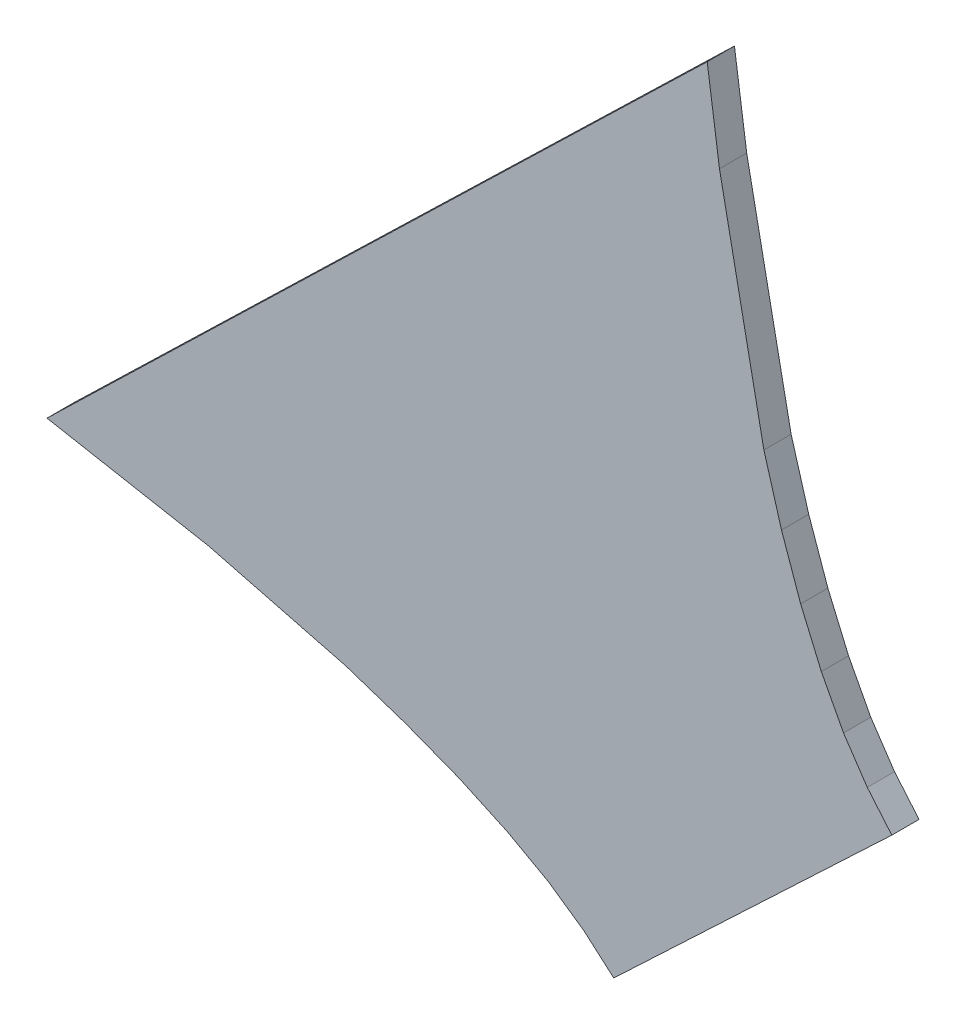
ISO-10303-21;
HEADER;
FILE_DESCRIPTION(('STEP AP214'),'2;1');
FILE_NAME('part.step','',(''),(''),'','','');
FILE_SCHEMA(('AUTOMOTIVE_DESIGN { 1 0 10303 214 1 1 1 1 }'));
ENDSEC;
DATA;
#1=APPLICATION_CONTEXT('core data for automotive mechanical design processes');
#2=APPLICATION_PROTOCOL_DEFINITION('international standard','automotive_design',2000,#1);
#3=PRODUCT_CONTEXT('',#1,'mechanical');
#4=PRODUCT('Part','Part','',(#3));
#5=PRODUCT_RELATED_PRODUCT_CATEGORY('part','',(#4));
#6=PRODUCT_DEFINITION_FORMATION('','',#4);
#7=PRODUCT_DEFINITION_CONTEXT('part definition',#1,'design');
#8=PRODUCT_DEFINITION('design','',#6,#7);
#9=PRODUCT_DEFINITION_SHAPE('','',#8);
#10=(LENGTH_UNIT() NAMED_UNIT(*) SI_UNIT(.MILLI.,.METRE.));
#11=(NAMED_UNIT(*) PLANE_ANGLE_UNIT() SI_UNIT($,.RADIAN.));
#12=(NAMED_UNIT(*) SI_UNIT($,.STERADIAN.) SOLID_ANGLE_UNIT());
#13=UNCERTAINTY_MEASURE_WITH_UNIT(LENGTH_MEASURE(1.E-05),#10,'distance_accuracy_value','');
#14=(GEOMETRIC_REPRESENTATION_CONTEXT(3) GLOBAL_UNCERTAINTY_ASSIGNED_CONTEXT((#13)) GLOBAL_UNIT_ASSIGNED_CONTEXT((#10,
#11,#12)) REPRESENTATION_CONTEXT('',''));
#15=CARTESIAN_POINT('',(0.,0.,0.));
#16=DIRECTION('',(0.,0.,1.));
#17=DIRECTION('',(1.,0.,0.));
#18=AXIS2_PLACEMENT_3D('',#15,#16,#17);
#19=CARTESIAN_POINT('',(49.0960006713867,108.747001647949,0.));
#20=DIRECTION('',(-0.764913189247132,-0.644133381308391,0.));
#21=DIRECTION('',(-0.644133381308391,0.764913189247132,0.));
#22=AXIS2_PLACEMENT_3D('',#19,#20,#21);
#23=PLANE('',#22);
#24=DIRECTION('',(-0.644133381308391,0.764913189247132,0.));
#25=VECTOR('',#24,1.);
#26=CARTESIAN_POINT('',(49.0960006713867,108.747001647949,0.03556));
#27=LINE('',#26,#25);
#28=CARTESIAN_POINT('',(49.0960006713867,108.747001647949,0.03556));
#29=VERTEX_POINT('',#28);
#30=CARTESIAN_POINT('',(49.0639991760254,108.785003662109,0.03556));
#31=VERTEX_POINT('',#30);
#32=EDGE_CURVE('E11',#29,#31,#27,.T.);
#33=ORIENTED_EDGE('',*,*,#32,.F.);
#34=DIRECTION('',(0.,0.,1.));
#35=VECTOR('',#34,1.);
#36=CARTESIAN_POINT('',(49.0960006713867,108.747001647949,0.));
#37=LINE('',#36,#35);
#38=CARTESIAN_POINT('',(49.0960006713867,108.747001647949,0.));
#39=VERTEX_POINT('',#38);
#40=EDGE_CURVE('E24',#39,#29,#37,.T.);
#41=ORIENTED_EDGE('',*,*,#40,.F.);
#42=DIRECTION('',(-0.644133381308391,0.764913189247132,0.));
#43=VECTOR('',#42,1.);
#44=CARTESIAN_POINT('',(49.0960006713867,108.747001647949,0.));
#45=LINE('',#44,#43);
#46=CARTESIAN_POINT('',(49.0639991760254,108.785003662109,0.));
#47=VERTEX_POINT('',#46);
#48=EDGE_CURVE('E160',#39,#47,#45,.T.);
#49=ORIENTED_EDGE('',*,*,#48,.T.);
#50=DIRECTION('',(0.,0.,1.));
#51=VECTOR('',#50,1.);
#52=CARTESIAN_POINT('',(49.0639991760254,108.785003662109,0.));
#53=LINE('',#52,#51);
#54=EDGE_CURVE('E37',#47,#31,#53,.T.);
#55=ORIENTED_EDGE('',*,*,#54,.T.);
#56=EDGE_LOOP('',(#33,#41,#49,#55));
#57=FACE_BOUND('',#56,.T.);
#58=ADVANCED_FACE('F17',(#57),#23,.F.);
#59=CARTESIAN_POINT('',(49.0639991760254,108.785003662109,0.));
#60=DIRECTION('',(-0.829267813334894,-0.558851405801903,0.));
#61=DIRECTION('',(-0.558851405801903,0.829267813334894,0.));
#62=AXIS2_PLACEMENT_3D('',#59,#60,#61);
#63=PLANE('',#62);
#64=DIRECTION('',(-0.558851405801903,0.829267813334894,0.));
#65=VECTOR('',#64,1.);
#66=CARTESIAN_POINT('',(49.0639991760254,108.785003662109,0.03556));
#67=LINE('',#66,#65);
#68=CARTESIAN_POINT('',(49.0330009460449,108.831001281738,0.03556));
#69=VERTEX_POINT('',#68);
#70=EDGE_CURVE('E280',#31,#69,#67,.T.);
#71=ORIENTED_EDGE('',*,*,#70,.F.);
#72=ORIENTED_EDGE('',*,*,#54,.F.);
#73=DIRECTION('',(-0.558851405801903,0.829267813334894,0.));
#74=VECTOR('',#73,1.);
#75=CARTESIAN_POINT('',(49.0639991760254,108.785003662109,0.));
#76=LINE('',#75,#74);
#77=CARTESIAN_POINT('',(49.0330009460449,108.831001281738,0.));
#78=VERTEX_POINT('',#77);
#79=EDGE_CURVE('E277',#47,#78,#76,.T.);
#80=ORIENTED_EDGE('',*,*,#79,.T.);
#81=DIRECTION('',(0.,0.,1.));
#82=VECTOR('',#81,1.);
#83=CARTESIAN_POINT('',(49.0330009460449,108.831001281738,0.));
#84=LINE('',#83,#82);
#85=EDGE_CURVE('E275',#78,#69,#84,.T.);
#86=ORIENTED_EDGE('',*,*,#85,.T.);
#87=EDGE_LOOP('',(#71,#72,#80,#86));
#88=FACE_BOUND('',#87,.T.);
#89=ADVANCED_FACE('F288',(#88),#63,.F.);
#90=CARTESIAN_POINT('',(49.0330009460449,108.831001281738,0.));
#91=DIRECTION('',(-0.884574623064749,-0.466398688066183,0.));
#92=DIRECTION('',(-0.466398688066183,0.884574623064749,0.));
#93=AXIS2_PLACEMENT_3D('',#90,#91,#92);
#94=PLANE('',#93);
#95=DIRECTION('',(-0.466398688066183,0.884574623064749,0.));
#96=VECTOR('',#95,1.);
#97=CARTESIAN_POINT('',(49.0330009460449,108.831001281738,0.03556));
#98=LINE('',#97,#96);
#99=CARTESIAN_POINT('',(49.0040016174316,108.886001586914,0.03556));
#100=VERTEX_POINT('',#99);
#101=EDGE_CURVE('E272',#69,#100,#98,.T.);
#102=ORIENTED_EDGE('',*,*,#101,.F.);
#103=ORIENTED_EDGE('',*,*,#85,.F.);
#104=DIRECTION('',(-0.466398688066183,0.884574623064749,0.));
#105=VECTOR('',#104,1.);
#106=CARTESIAN_POINT('',(49.0330009460449,108.831001281738,0.));
#107=LINE('',#106,#105);
#108=CARTESIAN_POINT('',(49.0040016174316,108.886001586914,0.));
#109=VERTEX_POINT('',#108);
#110=EDGE_CURVE('E269',#78,#109,#107,.T.);
#111=ORIENTED_EDGE('',*,*,#110,.T.);
#112=DIRECTION('',(0.,0.,1.));
#113=VECTOR('',#112,1.);
#114=CARTESIAN_POINT('',(49.0040016174316,108.886001586914,0.));
#115=LINE('',#114,#113);
#116=EDGE_CURVE('E267',#109,#100,#115,.T.);
#117=ORIENTED_EDGE('',*,*,#116,.T.);
#118=EDGE_LOOP('',(#102,#103,#111,#117));
#119=FACE_BOUND('',#118,.T.);
#120=ADVANCED_FACE('F294',(#119),#94,.F.);
#121=CARTESIAN_POINT('',(49.0040016174316,108.886001586914,0.));
#122=DIRECTION('',(-0.919133514210847,-0.393946167711298,0.));
#123=DIRECTION('',(-0.393946167711298,0.919133514210847,0.));
#124=AXIS2_PLACEMENT_3D('',#121,#122,#123);
#125=PLANE('',#124);
#126=DIRECTION('',(-0.393946167711298,0.919133514210847,0.));
#127=VECTOR('',#126,1.);
#128=CARTESIAN_POINT('',(49.0040016174316,108.886001586914,0.03556));
#129=LINE('',#128,#127);
#130=CARTESIAN_POINT('',(48.9770011901855,108.948997497559,0.03556));
#131=VERTEX_POINT('',#130);
#132=EDGE_CURVE('E264',#100,#131,#129,.T.);
#133=ORIENTED_EDGE('',*,*,#132,.F.);
#134=ORIENTED_EDGE('',*,*,#116,.F.);
#135=DIRECTION('',(-0.393946167711298,0.919133514210847,0.));
#136=VECTOR('',#135,1.);
#137=CARTESIAN_POINT('',(49.0040016174316,108.886001586914,0.));
#138=LINE('',#137,#136);
#139=CARTESIAN_POINT('',(48.9770011901855,108.948997497559,0.));
#140=VERTEX_POINT('',#139);
#141=EDGE_CURVE('E261',#109,#140,#138,.T.);
#142=ORIENTED_EDGE('',*,*,#141,.T.);
#143=DIRECTION('',(0.,0.,1.));
#144=VECTOR('',#143,1.);
#145=CARTESIAN_POINT('',(48.9770011901855,108.948997497559,0.));
#146=LINE('',#145,#144);
#147=EDGE_CURVE('E259',#140,#131,#146,.T.);
#148=ORIENTED_EDGE('',*,*,#147,.T.);
#149=EDGE_LOOP('',(#133,#134,#142,#148));
#150=FACE_BOUND('',#149,.T.);
#151=ADVANCED_FACE('F296',(#150),#125,.F.);
#152=CARTESIAN_POINT('',(48.9770011901855,108.948997497559,0.));
#153=DIRECTION('',(-0.943227736251427,-0.332146710906504,0.));
#154=DIRECTION('',(-0.332146710906504,0.943227736251427,0.));
#155=AXIS2_PLACEMENT_3D('',#152,#153,#154);
#156=PLANE('',#155);
#157=DIRECTION('',(-0.332146710906504,0.943227736251427,0.));
#158=VECTOR('',#157,1.);
#159=CARTESIAN_POINT('',(48.9770011901855,108.948997497559,0.03556));
#160=LINE('',#159,#158);
#161=CARTESIAN_POINT('',(48.9519996643066,109.019996643066,0.03556));
#162=VERTEX_POINT('',#161);
#163=EDGE_CURVE('E256',#131,#162,#160,.T.);
#164=ORIENTED_EDGE('',*,*,#163,.F.);
#165=ORIENTED_EDGE('',*,*,#147,.F.);
#166=DIRECTION('',(-0.332146710906504,0.943227736251427,0.));
#167=VECTOR('',#166,1.);
#168=CARTESIAN_POINT('',(48.9770011901855,108.948997497559,0.));
#169=LINE('',#168,#167);
#170=CARTESIAN_POINT('',(48.9519996643066,109.019996643066,0.));
#171=VERTEX_POINT('',#170);
#172=EDGE_CURVE('E253',#140,#171,#169,.T.);
#173=ORIENTED_EDGE('',*,*,#172,.T.);
#174=DIRECTION('',(0.,0.,1.));
#175=VECTOR('',#174,1.);
#176=CARTESIAN_POINT('',(48.9519996643066,109.019996643066,0.));
#177=LINE('',#176,#175);
#178=EDGE_CURVE('E251',#171,#162,#177,.T.);
#179=ORIENTED_EDGE('',*,*,#178,.T.);
#180=EDGE_LOOP('',(#164,#165,#173,#179));
#181=FACE_BOUND('',#180,.T.);
#182=ADVANCED_FACE('F301',(#181),#156,.F.);
#183=CARTESIAN_POINT('',(48.9519996643066,109.019996643066,0.));
#184=DIRECTION('',(-0.96014214957302,-0.279512168989654,0.));
#185=DIRECTION('',(-0.279512168989654,0.96014214957302,0.));
#186=AXIS2_PLACEMENT_3D('',#183,#184,#185);
#187=PLANE('',#186);
#188=DIRECTION('',(-0.279512168989654,0.96014214957302,0.));
#189=VECTOR('',#188,1.);
#190=CARTESIAN_POINT('',(48.9519996643066,109.019996643066,0.03556));
#191=LINE('',#190,#189);
#192=CARTESIAN_POINT('',(48.9290008544922,109.098999023438,0.03556));
#193=VERTEX_POINT('',#192);
#194=EDGE_CURVE('E248',#162,#193,#191,.T.);
#195=ORIENTED_EDGE('',*,*,#194,.F.);
#196=ORIENTED_EDGE('',*,*,#178,.F.);
#197=DIRECTION('',(-0.279512168989654,0.96014214957302,0.));
#198=VECTOR('',#197,1.);
#199=CARTESIAN_POINT('',(48.9519996643066,109.019996643066,0.));
#200=LINE('',#199,#198);
#201=CARTESIAN_POINT('',(48.9290008544922,109.098999023438,0.));
#202=VERTEX_POINT('',#201);
#203=EDGE_CURVE('E245',#171,#202,#200,.T.);
#204=ORIENTED_EDGE('',*,*,#203,.T.);
#205=DIRECTION('',(0.,0.,1.));
#206=VECTOR('',#205,1.);
#207=CARTESIAN_POINT('',(48.9290008544922,109.098999023438,0.));
#208=LINE('',#207,#206);
#209=EDGE_CURVE('E243',#202,#193,#208,.T.);
#210=ORIENTED_EDGE('',*,*,#209,.T.);
#211=EDGE_LOOP('',(#195,#196,#204,#210));
#212=FACE_BOUND('',#211,.T.);
#213=ADVANCED_FACE('F304',(#212),#187,.F.);
#214=CARTESIAN_POINT('',(48.9290008544922,109.098999023438,0.));
#215=DIRECTION('',(-0.980448550082548,-0.196775609873352,0.));
#216=DIRECTION('',(-0.196775609873352,0.980448550082548,0.));
#217=AXIS2_PLACEMENT_3D('',#214,#215,#216);
#218=PLANE('',#217);
#219=DIRECTION('',(-0.196775609873352,0.980448550082548,0.));
#220=VECTOR('',#219,1.);
#221=CARTESIAN_POINT('',(48.9290008544922,109.098999023438,0.03556));
#222=LINE('',#221,#220);
#223=CARTESIAN_POINT('',(48.8709983825684,109.388000488281,0.03556));
#224=VERTEX_POINT('',#223);
#225=EDGE_CURVE('E240',#193,#224,#222,.T.);
#226=ORIENTED_EDGE('',*,*,#225,.F.);
#227=ORIENTED_EDGE('',*,*,#209,.F.);
#228=DIRECTION('',(-0.196775609873352,0.980448550082548,0.));
#229=VECTOR('',#228,1.);
#230=CARTESIAN_POINT('',(48.9290008544922,109.098999023438,0.));
#231=LINE('',#230,#229);
#232=CARTESIAN_POINT('',(48.8709983825684,109.388000488281,0.));
#233=VERTEX_POINT('',#232);
#234=EDGE_CURVE('E237',#202,#233,#231,.T.);
#235=ORIENTED_EDGE('',*,*,#234,.T.);
#236=DIRECTION('',(0.,0.,1.));
#237=VECTOR('',#236,1.);
#238=CARTESIAN_POINT('',(48.8709983825684,109.388000488281,0.));
#239=LINE('',#238,#237);
#240=EDGE_CURVE('E235',#233,#224,#239,.T.);
#241=ORIENTED_EDGE('',*,*,#240,.T.);
#242=EDGE_LOOP('',(#226,#227,#235,#241));
#243=FACE_BOUND('',#242,.T.);
#244=ADVANCED_FACE('F309',(#243),#218,.F.);
#245=CARTESIAN_POINT('',(48.8709983825684,109.388000488281,0.));
#246=DIRECTION('',(-0.990125208563686,-0.140185845814466,0.));
#247=DIRECTION('',(-0.140185845814466,0.990125208563686,0.));
#248=AXIS2_PLACEMENT_3D('',#245,#246,#247);
#249=PLANE('',#248);
#250=DIRECTION('',(-0.140185845814466,0.990125208563686,0.));
#251=VECTOR('',#250,1.);
#252=CARTESIAN_POINT('',(48.8709983825684,109.388000488281,0.03556));
#253=LINE('',#252,#251);
#254=CARTESIAN_POINT('',(48.8549995422363,109.500999450684,0.03556));
#255=VERTEX_POINT('',#254);
#256=EDGE_CURVE('E232',#224,#255,#253,.T.);
#257=ORIENTED_EDGE('',*,*,#256,.F.);
#258=ORIENTED_EDGE('',*,*,#240,.F.);
#259=DIRECTION('',(-0.140185845814466,0.990125208563686,0.));
#260=VECTOR('',#259,1.);
#261=CARTESIAN_POINT('',(48.8709983825684,109.388000488281,0.));
#262=LINE('',#261,#260);
#263=CARTESIAN_POINT('',(48.8549995422363,109.500999450684,0.));
#264=VERTEX_POINT('',#263);
#265=EDGE_CURVE('E229',#233,#264,#262,.T.);
#266=ORIENTED_EDGE('',*,*,#265,.T.);
#267=DIRECTION('',(0.,0.,1.));
#268=VECTOR('',#267,1.);
#269=CARTESIAN_POINT('',(48.8549995422363,109.500999450684,0.));
#270=LINE('',#269,#268);
#271=EDGE_CURVE('E227',#264,#255,#270,.T.);
#272=ORIENTED_EDGE('',*,*,#271,.T.);
#273=EDGE_LOOP('',(#257,#258,#266,#272));
#274=FACE_BOUND('',#273,.T.);
#275=ADVANCED_FACE('F312',(#274),#249,.F.);
#276=CARTESIAN_POINT('',(48.8549995422363,109.500999450684,0.));
#277=DIRECTION('',(0.69533813950602,-0.718682733720733,0.));
#278=DIRECTION('',(-0.718682733720733,-0.69533813950602,0.));
#279=AXIS2_PLACEMENT_3D('',#276,#277,#278);
#280=PLANE('',#279);
#281=DIRECTION('',(-0.718682733720733,-0.69533813950602,0.));
#282=VECTOR('',#281,1.);
#283=CARTESIAN_POINT('',(48.8549995422363,109.500999450684,0.03556));
#284=LINE('',#283,#282);
#285=CARTESIAN_POINT('',(47.9930000305176,108.666999816895,0.03556));
#286=VERTEX_POINT('',#285);
#287=EDGE_CURVE('E224',#255,#286,#284,.T.);
#288=ORIENTED_EDGE('',*,*,#287,.F.);
#289=ORIENTED_EDGE('',*,*,#271,.F.);
#290=DIRECTION('',(-0.718682733720733,-0.69533813950602,0.));
#291=VECTOR('',#290,1.);
#292=CARTESIAN_POINT('',(48.8549995422363,109.500999450684,0.));
#293=LINE('',#292,#291);
#294=CARTESIAN_POINT('',(47.9930000305176,108.666999816895,0.));
#295=VERTEX_POINT('',#294);
#296=EDGE_CURVE('E221',#264,#295,#293,.T.);
#297=ORIENTED_EDGE('',*,*,#296,.T.);
#298=DIRECTION('',(0.,0.,1.));
#299=VECTOR('',#298,1.);
#300=CARTESIAN_POINT('',(47.9930000305176,108.666999816895,0.));
#301=LINE('',#300,#299);
#302=EDGE_CURVE('E219',#295,#286,#301,.T.);
#303=ORIENTED_EDGE('',*,*,#302,.T.);
#304=EDGE_LOOP('',(#288,#289,#297,#303));
#305=FACE_BOUND('',#304,.T.);
#306=ADVANCED_FACE('F317',(#305),#280,.F.);
#307=CARTESIAN_POINT('',(47.9930000305176,108.666999816895,0.));
#308=DIRECTION('',(0.181763302610869,0.983342311620928,0.));
#309=DIRECTION('',(0.983342311620928,-0.181763302610869,0.));
#310=AXIS2_PLACEMENT_3D('',#307,#308,#309);
#311=PLANE('',#310);
#312=DIRECTION('',(0.983342311620928,-0.181763302610869,0.));
#313=VECTOR('',#312,1.);
#314=CARTESIAN_POINT('',(47.9930000305176,108.666999816895,0.03556));
#315=LINE('',#314,#313);
#316=CARTESIAN_POINT('',(48.2039985656738,108.627998352051,0.03556));
#317=VERTEX_POINT('',#316);
#318=EDGE_CURVE('E216',#286,#317,#315,.T.);
#319=ORIENTED_EDGE('',*,*,#318,.F.);
#320=ORIENTED_EDGE('',*,*,#302,.F.);
#321=DIRECTION('',(0.983342311620928,-0.181763302610869,0.));
#322=VECTOR('',#321,1.);
#323=CARTESIAN_POINT('',(47.9930000305176,108.666999816895,0.));
#324=LINE('',#323,#322);
#325=CARTESIAN_POINT('',(48.2039985656738,108.627998352051,0.));
#326=VERTEX_POINT('',#325);
#327=EDGE_CURVE('E213',#295,#326,#324,.T.);
#328=ORIENTED_EDGE('',*,*,#327,.T.);
#329=DIRECTION('',(0.,0.,1.));
#330=VECTOR('',#329,1.);
#331=CARTESIAN_POINT('',(48.2039985656738,108.627998352051,0.));
#332=LINE('',#331,#330);
#333=EDGE_CURVE('E211',#326,#317,#332,.T.);
#334=ORIENTED_EDGE('',*,*,#333,.T.);
#335=EDGE_LOOP('',(#319,#320,#328,#334));
#336=FACE_BOUND('',#335,.T.);
#337=ADVANCED_FACE('F320',(#336),#311,.F.);
#338=CARTESIAN_POINT('',(48.2039985656738,108.627998352051,0.));
#339=DIRECTION('',(0.248882834999319,0.968533600058719,0.));
#340=DIRECTION('',(0.968533600058719,-0.248882834999319,0.));
#341=AXIS2_PLACEMENT_3D('',#338,#339,#340);
#342=PLANE('',#341);
#343=DIRECTION('',(0.968533600058719,-0.248882834999319,0.));
#344=VECTOR('',#343,1.);
#345=CARTESIAN_POINT('',(48.2039985656738,108.627998352051,0.03556));
#346=LINE('',#345,#344);
#347=CARTESIAN_POINT('',(48.382999420166,108.582000732422,0.03556));
#348=VERTEX_POINT('',#347);
#349=EDGE_CURVE('E208',#317,#348,#346,.T.);
#350=ORIENTED_EDGE('',*,*,#349,.F.);
#351=ORIENTED_EDGE('',*,*,#333,.F.);
#352=DIRECTION('',(0.968533600058719,-0.248882834999319,0.));
#353=VECTOR('',#352,1.);
#354=CARTESIAN_POINT('',(48.2039985656738,108.627998352051,0.));
#355=LINE('',#354,#353);
#356=CARTESIAN_POINT('',(48.382999420166,108.582000732422,0.));
#357=VERTEX_POINT('',#356);
#358=EDGE_CURVE('E205',#326,#357,#355,.T.);
#359=ORIENTED_EDGE('',*,*,#358,.T.);
#360=DIRECTION('',(0.,0.,1.));
#361=VECTOR('',#360,1.);
#362=CARTESIAN_POINT('',(48.382999420166,108.582000732422,0.));
#363=LINE('',#362,#361);
#364=EDGE_CURVE('E203',#357,#348,#363,.T.);
#365=ORIENTED_EDGE('',*,*,#364,.T.);
#366=EDGE_LOOP('',(#350,#351,#359,#365));
#367=FACE_BOUND('',#366,.T.);
#368=ADVANCED_FACE('F325',(#367),#342,.F.);
#369=CARTESIAN_POINT('',(48.382999420166,108.582000732422,0.));
#370=DIRECTION('',(0.316241685071052,0.94867865825232,0.));
#371=DIRECTION('',(0.94867865825232,-0.316241685071052,0.));
#372=AXIS2_PLACEMENT_3D('',#369,#370,#371);
#373=PLANE('',#372);
#374=DIRECTION('',(0.948678658252319,-0.316241685071052,0.));
#375=VECTOR('',#374,1.);
#376=CARTESIAN_POINT('',(48.382999420166,108.582000732422,0.03556));
#377=LINE('',#376,#375);
#378=CARTESIAN_POINT('',(48.4609985351562,108.555999755859,0.03556));
#379=VERTEX_POINT('',#378);
#380=EDGE_CURVE('E200',#348,#379,#377,.T.);
#381=ORIENTED_EDGE('',*,*,#380,.F.);
#382=ORIENTED_EDGE('',*,*,#364,.F.);
#383=DIRECTION('',(0.948678658252319,-0.316241685071052,0.));
#384=VECTOR('',#383,1.);
#385=CARTESIAN_POINT('',(48.382999420166,108.582000732422,0.));
#386=LINE('',#385,#384);
#387=CARTESIAN_POINT('',(48.4609985351562,108.555999755859,0.));
#388=VERTEX_POINT('',#387);
#389=EDGE_CURVE('E197',#357,#388,#386,.T.);
#390=ORIENTED_EDGE('',*,*,#389,.T.);
#391=DIRECTION('',(0.,0.,1.));
#392=VECTOR('',#391,1.);
#393=CARTESIAN_POINT('',(48.4609985351562,108.555999755859,0.));
#394=LINE('',#393,#392);
#395=EDGE_CURVE('E195',#388,#379,#394,.T.);
#396=ORIENTED_EDGE('',*,*,#395,.T.);
#397=EDGE_LOOP('',(#381,#382,#390,#396));
#398=FACE_BOUND('',#397,.T.);
#399=ADVANCED_FACE('F328',(#398),#373,.F.);
#400=CARTESIAN_POINT('',(48.4609985351562,108.555999755859,0.));
#401=DIRECTION('',(0.359878391055224,0.932999219534241,0.));
#402=DIRECTION('',(0.932999219534241,-0.359878391055224,0.));
#403=AXIS2_PLACEMENT_3D('',#400,#401,#402);
#404=PLANE('',#403);
#405=DIRECTION('',(0.932999219534241,-0.359878391055224,0.));
#406=VECTOR('',#405,1.);
#407=CARTESIAN_POINT('',(48.4609985351562,108.555999755859,0.03556));
#408=LINE('',#407,#406);
#409=CARTESIAN_POINT('',(48.5309982299805,108.528999328613,0.03556));
#410=VERTEX_POINT('',#409);
#411=EDGE_CURVE('E192',#379,#410,#408,.T.);
#412=ORIENTED_EDGE('',*,*,#411,.F.);
#413=ORIENTED_EDGE('',*,*,#395,.F.);
#414=DIRECTION('',(0.932999219534241,-0.359878391055224,0.));
#415=VECTOR('',#414,1.);
#416=CARTESIAN_POINT('',(48.4609985351562,108.555999755859,0.));
#417=LINE('',#416,#415);
#418=CARTESIAN_POINT('',(48.5309982299805,108.528999328613,0.));
#419=VERTEX_POINT('',#418);
#420=EDGE_CURVE('E189',#388,#419,#417,.T.);
#421=ORIENTED_EDGE('',*,*,#420,.T.);
#422=DIRECTION('',(0.,0.,1.));
#423=VECTOR('',#422,1.);
#424=CARTESIAN_POINT('',(48.5309982299805,108.528999328613,0.));
#425=LINE('',#424,#423);
#426=EDGE_CURVE('E187',#419,#410,#425,.T.);
#427=ORIENTED_EDGE('',*,*,#426,.T.);
#428=EDGE_LOOP('',(#412,#413,#421,#427));
#429=FACE_BOUND('',#428,.T.);
#430=ADVANCED_FACE('F333',(#429),#404,.F.);
#431=CARTESIAN_POINT('',(48.5309982299805,108.528999328613,0.));
#432=DIRECTION('',(0.418116230709966,0.908393536754248,0.));
#433=DIRECTION('',(0.908393536754248,-0.418116230709966,0.));
#434=AXIS2_PLACEMENT_3D('',#431,#432,#433);
#435=PLANE('',#434);
#436=DIRECTION('',(0.908393536754248,-0.418116230709966,0.));
#437=VECTOR('',#436,1.);
#438=CARTESIAN_POINT('',(48.5309982299805,108.528999328613,0.03556));
#439=LINE('',#438,#437);
#440=CARTESIAN_POINT('',(48.5940017700195,108.5,0.03556));
#441=VERTEX_POINT('',#440);
#442=EDGE_CURVE('E184',#410,#441,#439,.T.);
#443=ORIENTED_EDGE('',*,*,#442,.F.);
#444=ORIENTED_EDGE('',*,*,#426,.F.);
#445=DIRECTION('',(0.908393536754248,-0.418116230709966,0.));
#446=VECTOR('',#445,1.);
#447=CARTESIAN_POINT('',(48.5309982299805,108.528999328613,0.));
#448=LINE('',#447,#446);
#449=CARTESIAN_POINT('',(48.5940017700195,108.5,0.));
#450=VERTEX_POINT('',#449);
#451=EDGE_CURVE('E181',#419,#450,#448,.T.);
#452=ORIENTED_EDGE('',*,*,#451,.T.);
#453=DIRECTION('',(0.,0.,1.));
#454=VECTOR('',#453,1.);
#455=CARTESIAN_POINT('',(48.5940017700195,108.5,0.));
#456=LINE('',#455,#454);
#457=EDGE_CURVE('E179',#450,#441,#456,.T.);
#458=ORIENTED_EDGE('',*,*,#457,.T.);
#459=EDGE_LOOP('',(#443,#444,#452,#458));
#460=FACE_BOUND('',#459,.T.);
#461=ADVANCED_FACE('F336',(#460),#435,.F.);
#462=CARTESIAN_POINT('',(48.5940017700195,108.5,0.));
#463=DIRECTION('',(0.48564817459296,0.874154363092999,0.));
#464=DIRECTION('',(0.874154363092999,-0.48564817459296,0.));
#465=AXIS2_PLACEMENT_3D('',#462,#463,#464);
#466=PLANE('',#465);
#467=DIRECTION('',(0.874154363092999,-0.48564817459296,0.));
#468=VECTOR('',#467,1.);
#469=CARTESIAN_POINT('',(48.5940017700195,108.5,0.03556));
#470=LINE('',#469,#468);
#471=CARTESIAN_POINT('',(48.6479988098145,108.470001220703,0.03556));
#472=VERTEX_POINT('',#471);
#473=EDGE_CURVE('E176',#441,#472,#470,.T.);
#474=ORIENTED_EDGE('',*,*,#473,.F.);
#475=ORIENTED_EDGE('',*,*,#457,.F.);
#476=DIRECTION('',(0.874154363092999,-0.48564817459296,0.));
#477=VECTOR('',#476,1.);
#478=CARTESIAN_POINT('',(48.5940017700195,108.5,0.));
#479=LINE('',#478,#477);
#480=CARTESIAN_POINT('',(48.6479988098145,108.470001220703,0.));
#481=VERTEX_POINT('',#480);
#482=EDGE_CURVE('E173',#450,#481,#479,.T.);
#483=ORIENTED_EDGE('',*,*,#482,.T.);
#484=DIRECTION('',(0.,0.,1.));
#485=VECTOR('',#484,1.);
#486=CARTESIAN_POINT('',(48.6479988098145,108.470001220703,0.));
#487=LINE('',#486,#485);
#488=EDGE_CURVE('E171',#481,#472,#487,.T.);
#489=ORIENTED_EDGE('',*,*,#488,.T.);
#490=EDGE_LOOP('',(#474,#475,#483,#489));
#491=FACE_BOUND('',#490,.T.);
#492=ADVANCED_FACE('F341',(#491),#466,.F.);
#493=CARTESIAN_POINT('',(48.6479988098145,108.470001220703,0.));
#494=DIRECTION('',(0.571024595638433,0.820932951693355,0.));
#495=DIRECTION('',(0.820932951693355,-0.571024595638433,0.));
#496=AXIS2_PLACEMENT_3D('',#493,#494,#495);
#497=PLANE('',#496);
#498=DIRECTION('',(0.820932951693355,-0.571024595638433,0.));
#499=VECTOR('',#498,1.);
#500=CARTESIAN_POINT('',(48.6479988098145,108.470001220703,0.03556));
#501=LINE('',#500,#499);
#502=CARTESIAN_POINT('',(48.6940002441406,108.438003540039,0.03556));
#503=VERTEX_POINT('',#502);
#504=EDGE_CURVE('E168',#472,#503,#501,.T.);
#505=ORIENTED_EDGE('',*,*,#504,.F.);
#506=ORIENTED_EDGE('',*,*,#488,.F.);
#507=DIRECTION('',(0.820932951693355,-0.571024595638433,0.));
#508=VECTOR('',#507,1.);
#509=CARTESIAN_POINT('',(48.6479988098145,108.470001220703,0.));
#510=LINE('',#509,#508);
#511=CARTESIAN_POINT('',(48.6940002441406,108.438003540039,0.));
#512=VERTEX_POINT('',#511);
#513=EDGE_CURVE('E166',#481,#512,#510,.T.);
#514=ORIENTED_EDGE('',*,*,#513,.T.);
#515=DIRECTION('',(0.,0.,1.));
#516=VECTOR('',#515,1.);
#517=CARTESIAN_POINT('',(48.6940002441406,108.438003540039,0.));
#518=LINE('',#517,#516);
#519=EDGE_CURVE('E151',#512,#503,#518,.T.);
#520=ORIENTED_EDGE('',*,*,#519,.T.);
#521=EDGE_LOOP('',(#505,#506,#514,#520));
#522=FACE_BOUND('',#521,.T.);
#523=ADVANCED_FACE('F343',(#522),#497,.F.);
#524=CARTESIAN_POINT('',(48.6940002441406,108.438003540039,0.));
#525=DIRECTION('',(0.657167420970867,0.753744638995529,0.));
#526=DIRECTION('',(0.753744638995529,-0.657167420970867,0.));
#527=AXIS2_PLACEMENT_3D('',#524,#525,#526);
#528=PLANE('',#527);
#529=DIRECTION('',(0.753744638995529,-0.657167420970867,0.));
#530=VECTOR('',#529,1.);
#531=CARTESIAN_POINT('',(48.6940002441406,108.438003540039,0.03556));
#532=LINE('',#531,#530);
#533=CARTESIAN_POINT('',(48.7330017089844,108.403999328613,0.03556));
#534=VERTEX_POINT('',#533);
#535=EDGE_CURVE('E155',#503,#534,#532,.T.);
#536=ORIENTED_EDGE('',*,*,#535,.F.);
#537=ORIENTED_EDGE('',*,*,#519,.F.);
#538=DIRECTION('',(0.753744638995529,-0.657167420970867,0.));
#539=VECTOR('',#538,1.);
#540=CARTESIAN_POINT('',(48.6940002441406,108.438003540039,0.));
#541=LINE('',#540,#539);
#542=CARTESIAN_POINT('',(48.7330017089844,108.403999328613,0.));
#543=VERTEX_POINT('',#542);
#544=EDGE_CURVE('E147',#512,#543,#541,.T.);
#545=ORIENTED_EDGE('',*,*,#544,.T.);
#546=DIRECTION('',(0.,0.,1.));
#547=VECTOR('',#546,1.);
#548=CARTESIAN_POINT('',(48.7330017089844,108.403999328613,0.));
#549=LINE('',#548,#547);
#550=EDGE_CURVE('E137',#543,#534,#549,.T.);
#551=ORIENTED_EDGE('',*,*,#550,.T.);
#552=EDGE_LOOP('',(#536,#537,#545,#551));
#553=FACE_BOUND('',#552,.T.);
#554=ADVANCED_FACE('F150',(#553),#528,.F.);
#555=CARTESIAN_POINT('',(48.7330017089844,108.403999328613,0.));
#556=DIRECTION('',(-0.686803391521244,0.726843244031969,0.));
#557=DIRECTION('',(0.726843244031969,0.686803391521244,0.));
#558=AXIS2_PLACEMENT_3D('',#555,#556,#557);
#559=PLANE('',#558);
#560=DIRECTION('',(0.726843244031969,0.686803391521244,0.));
#561=VECTOR('',#560,1.);
#562=CARTESIAN_POINT('',(48.7330017089844,108.403999328613,0.03556));
#563=LINE('',#562,#561);
#564=EDGE_CURVE('E143',#534,#29,#563,.T.);
#565=ORIENTED_EDGE('',*,*,#564,.F.);
#566=ORIENTED_EDGE('',*,*,#550,.F.);
#567=DIRECTION('',(0.726843244031969,0.686803391521244,0.));
#568=VECTOR('',#567,1.);
#569=CARTESIAN_POINT('',(48.7330017089844,108.403999328613,0.));
#570=LINE('',#569,#568);
#571=EDGE_CURVE('E141',#543,#39,#570,.T.);
#572=ORIENTED_EDGE('',*,*,#571,.T.);
#573=ORIENTED_EDGE('',*,*,#40,.T.);
#574=EDGE_LOOP('',(#565,#566,#572,#573));
#575=FACE_BOUND('',#574,.T.);
#576=ADVANCED_FACE('F139',(#575),#559,.F.);
#577=CARTESIAN_POINT('',(49.0960006713867,108.747001647949,0.));
#578=DIRECTION('',(0.,0.,1.));
#579=DIRECTION('',(1.,0.,0.));
#580=AXIS2_PLACEMENT_3D('',#577,#578,#579);
#581=PLANE('',#580);
#582=ORIENTED_EDGE('',*,*,#571,.F.);
#583=ORIENTED_EDGE('',*,*,#544,.F.);
#584=ORIENTED_EDGE('',*,*,#513,.F.);
#585=ORIENTED_EDGE('',*,*,#482,.F.);
#586=ORIENTED_EDGE('',*,*,#451,.F.);
#587=ORIENTED_EDGE('',*,*,#420,.F.);
#588=ORIENTED_EDGE('',*,*,#389,.F.);
#589=ORIENTED_EDGE('',*,*,#358,.F.);
#590=ORIENTED_EDGE('',*,*,#327,.F.);
#591=ORIENTED_EDGE('',*,*,#296,.F.);
#592=ORIENTED_EDGE('',*,*,#265,.F.);
#593=ORIENTED_EDGE('',*,*,#234,.F.);
#594=ORIENTED_EDGE('',*,*,#203,.F.);
#595=ORIENTED_EDGE('',*,*,#172,.F.);
#596=ORIENTED_EDGE('',*,*,#141,.F.);
#597=ORIENTED_EDGE('',*,*,#110,.F.);
#598=ORIENTED_EDGE('',*,*,#79,.F.);
#599=ORIENTED_EDGE('',*,*,#48,.F.);
#600=EDGE_LOOP('',(#582,#583,#584,#585,#586,#587,#588,#589,#590,#591,#592,#593,#594,#595,#596,
#597,#598,#599));
#601=FACE_BOUND('',#600,.T.);
#602=ADVANCED_FACE('F158',(#601),#581,.F.);
#603=CARTESIAN_POINT('',(49.0960006713867,108.747001647949,0.03556));
#604=DIRECTION('',(0.,0.,1.));
#605=DIRECTION('',(1.,0.,0.));
#606=AXIS2_PLACEMENT_3D('',#603,#604,#605);
#607=PLANE('',#606);
#608=ORIENTED_EDGE('',*,*,#32,.T.);
#609=ORIENTED_EDGE('',*,*,#70,.T.);
#610=ORIENTED_EDGE('',*,*,#101,.T.);
#611=ORIENTED_EDGE('',*,*,#132,.T.);
#612=ORIENTED_EDGE('',*,*,#163,.T.);
#613=ORIENTED_EDGE('',*,*,#194,.T.);
#614=ORIENTED_EDGE('',*,*,#225,.T.);
#615=ORIENTED_EDGE('',*,*,#256,.T.);
#616=ORIENTED_EDGE('',*,*,#287,.T.);
#617=ORIENTED_EDGE('',*,*,#318,.T.);
#618=ORIENTED_EDGE('',*,*,#349,.T.);
#619=ORIENTED_EDGE('',*,*,#380,.T.);
#620=ORIENTED_EDGE('',*,*,#411,.T.);
#621=ORIENTED_EDGE('',*,*,#442,.T.);
#622=ORIENTED_EDGE('',*,*,#473,.T.);
#623=ORIENTED_EDGE('',*,*,#504,.T.);
#624=ORIENTED_EDGE('',*,*,#535,.T.);
#625=ORIENTED_EDGE('',*,*,#564,.T.);
#626=EDGE_LOOP('',(#608,#609,#610,#611,#612,#613,#614,#615,#616,#617,#618,#619,#620,#621,#622,
#623,#624,#625));
#627=FACE_BOUND('',#626,.T.);
#628=ADVANCED_FACE('F291',(#627),#607,.T.);
#629=CLOSED_SHELL('',(#58,#89,#120,#151,#182,#213,#244,#275,#306,#337,#368,#399,#430,#461,#492,
#523,#554,#576,#602,#628));
#630=MANIFOLD_SOLID_BREP('B1',#629);
#631=ADVANCED_BREP_SHAPE_REPRESENTATION('',(#18,#630),#14);
#632=SHAPE_DEFINITION_REPRESENTATION(#9,#631);
ENDSEC;
END-ISO-10303-21;
